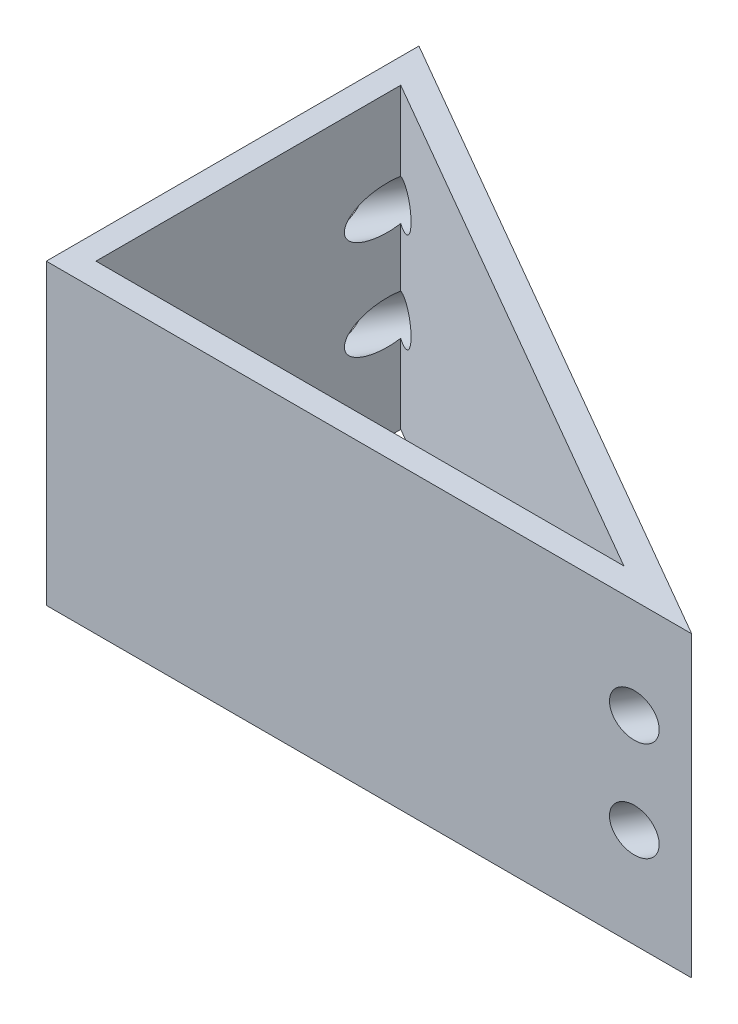
ISO-10303-21;
HEADER;
FILE_DESCRIPTION(('STEP AP214'),'2;1');
FILE_NAME('part.step','',(''),(''),'','','');
FILE_SCHEMA(('AUTOMOTIVE_DESIGN { 1 0 10303 214 1 1 1 1 }'));
ENDSEC;
DATA;
#1=APPLICATION_CONTEXT('core data for automotive mechanical design processes');
#2=APPLICATION_PROTOCOL_DEFINITION('international standard','automotive_design',2000,#1);
#3=PRODUCT_CONTEXT('',#1,'mechanical');
#4=PRODUCT('Part','Part','',(#3));
#5=PRODUCT_RELATED_PRODUCT_CATEGORY('part','',(#4));
#6=PRODUCT_DEFINITION_FORMATION('','',#4);
#7=PRODUCT_DEFINITION_CONTEXT('part definition',#1,'design');
#8=PRODUCT_DEFINITION('design','',#6,#7);
#9=PRODUCT_DEFINITION_SHAPE('','',#8);
#10=(LENGTH_UNIT() NAMED_UNIT(*) SI_UNIT(.MILLI.,.METRE.));
#11=(NAMED_UNIT(*) PLANE_ANGLE_UNIT() SI_UNIT($,.RADIAN.));
#12=(NAMED_UNIT(*) SI_UNIT($,.STERADIAN.) SOLID_ANGLE_UNIT());
#13=UNCERTAINTY_MEASURE_WITH_UNIT(LENGTH_MEASURE(1.E-05),#10,'distance_accuracy_value','');
#14=(GEOMETRIC_REPRESENTATION_CONTEXT(3) GLOBAL_UNCERTAINTY_ASSIGNED_CONTEXT((#13)) GLOBAL_UNIT_ASSIGNED_CONTEXT((#10,
#11,#12)) REPRESENTATION_CONTEXT('',''));
#15=CARTESIAN_POINT('',(0.,0.,0.));
#16=DIRECTION('',(0.,0.,1.));
#17=DIRECTION('',(1.,0.,0.));
#18=AXIS2_PLACEMENT_3D('',#15,#16,#17);
#19=CARTESIAN_POINT('',(82.4889197104681,38.1,0.));
#20=DIRECTION('',(0.,0.,-1.));
#21=DIRECTION('',(-1.,0.,0.));
#22=AXIS2_PLACEMENT_3D('',#19,#20,#21);
#23=PLANE('',#22);
#24=CARTESIAN_POINT('',(75.1565712917599,12.7,0.));
#25=DIRECTION('',(0.,0.,-1.));
#26=DIRECTION('',(1.,0.,0.));
#27=AXIS2_PLACEMENT_3D('',#24,#25,#26);
#28=ELLIPSE('',#27,3.17542648054292,2.74999999999999);
#29=CARTESIAN_POINT('',(78.3319977723028,12.7,0.));
#30=VERTEX_POINT('',#29);
#31=EDGE_CURVE('E214',#30,#30,#28,.T.);
#32=ORIENTED_EDGE('',*,*,#31,.T.);
#33=EDGE_LOOP('',(#32));
#34=FACE_BOUND('',#33,.T.);
#35=CARTESIAN_POINT('',(75.1565712917599,25.4,0.));
#36=DIRECTION('',(0.,0.,-1.));
#37=DIRECTION('',(1.,0.,0.));
#38=AXIS2_PLACEMENT_3D('',#35,#36,#37);
#39=ELLIPSE('',#38,3.17542648054292,2.74999999999999);
#40=CARTESIAN_POINT('',(78.3319977723028,25.4,0.));
#41=VERTEX_POINT('',#40);
#42=EDGE_CURVE('E159',#41,#41,#39,.T.);
#43=ORIENTED_EDGE('',*,*,#42,.T.);
#44=EDGE_LOOP('',(#43));
#45=FACE_BOUND('',#44,.T.);
#46=DIRECTION('',(1.,0.,0.));
#47=VECTOR('',#46,1.);
#48=CARTESIAN_POINT('',(82.4889197104681,0.,0.));
#49=LINE('',#48,#47);
#50=CARTESIAN_POINT('',(0.,0.,0.));
#51=VERTEX_POINT('',#50);
#52=CARTESIAN_POINT('',(82.4889197104681,0.,0.));
#53=VERTEX_POINT('',#52);
#54=EDGE_CURVE('E112',#51,#53,#49,.T.);
#55=ORIENTED_EDGE('',*,*,#54,.T.);
#56=DIRECTION('',(0.,-1.,0.));
#57=VECTOR('',#56,1.);
#58=CARTESIAN_POINT('',(82.4889197104681,38.1,0.));
#59=LINE('',#58,#57);
#60=CARTESIAN_POINT('',(82.4889197104681,38.1,0.));
#61=VERTEX_POINT('',#60);
#62=EDGE_CURVE('E146',#61,#53,#59,.T.);
#63=ORIENTED_EDGE('',*,*,#62,.F.);
#64=DIRECTION('',(1.,0.,0.));
#65=VECTOR('',#64,1.);
#66=CARTESIAN_POINT('',(82.4889197104681,38.1,0.));
#67=LINE('',#66,#65);
#68=CARTESIAN_POINT('',(0.,38.1,0.));
#69=VERTEX_POINT('',#68);
#70=EDGE_CURVE('E130',#69,#61,#67,.T.);
#71=ORIENTED_EDGE('',*,*,#70,.F.);
#72=DIRECTION('',(0.,-1.,0.));
#73=VECTOR('',#72,1.);
#74=CARTESIAN_POINT('',(0.,38.1,0.));
#75=LINE('',#74,#73);
#76=EDGE_CURVE('E137',#69,#51,#75,.T.);
#77=ORIENTED_EDGE('',*,*,#76,.T.);
#78=EDGE_LOOP('',(#55,#63,#71,#77));
#79=FACE_BOUND('',#78,.T.);
#80=ADVANCED_FACE('F36',(#34,#45,#79),#23,.F.);
#81=CARTESIAN_POINT('',(0.,38.1,-47.6249999999995));
#82=DIRECTION('',(-0.499999999999995,0.,0.866025403784442));
#83=DIRECTION('',(0.866025403784442,0.,0.499999999999995));
#84=AXIS2_PLACEMENT_3D('',#81,#82,#83);
#85=PLANE('',#84);
#86=CARTESIAN_POINT('',(5.49926131403122,12.7,-44.4499999999995));
#87=DIRECTION('',(0.499999999999995,0.,-0.866025403784442));
#88=DIRECTION('',(-0.866025403784442,0.,-0.499999999999995));
#89=AXIS2_PLACEMENT_3D('',#86,#87,#88);
#90=CIRCLE('',#89,2.74999999999999);
#91=CARTESIAN_POINT('',(3.11769145362401,12.7,-45.8249999999995));
#92=VERTEX_POINT('',#91);
#93=EDGE_CURVE('E106',#92,#92,#90,.T.);
#94=ORIENTED_EDGE('',*,*,#93,.F.);
#95=EDGE_LOOP('',(#94));
#96=FACE_BOUND('',#95,.T.);
#97=CARTESIAN_POINT('',(76.9896583964369,12.7,-3.17499999999996));
#98=DIRECTION('',(0.499999999999995,0.,-0.866025403784442));
#99=DIRECTION('',(-0.866025403784442,0.,-0.499999999999995));
#100=AXIS2_PLACEMENT_3D('',#97,#98,#99);
#101=CIRCLE('',#100,2.74999999999999);
#102=CARTESIAN_POINT('',(74.6080885360297,12.7,-4.54999999999994));
#103=VERTEX_POINT('',#102);
#104=EDGE_CURVE('E223',#103,#103,#101,.T.);
#105=ORIENTED_EDGE('',*,*,#104,.F.);
#106=EDGE_LOOP('',(#105));
#107=FACE_BOUND('',#106,.T.);
#108=CARTESIAN_POINT('',(76.9896583964369,25.4,-3.17499999999996));
#109=DIRECTION('',(0.499999999999995,0.,-0.866025403784442));
#110=DIRECTION('',(-0.866025403784442,0.,-0.499999999999995));
#111=AXIS2_PLACEMENT_3D('',#108,#109,#110);
#112=CIRCLE('',#111,2.74999999999999);
#113=CARTESIAN_POINT('',(74.6080885360297,25.4,-4.54999999999994));
#114=VERTEX_POINT('',#113);
#115=EDGE_CURVE('E218',#114,#114,#112,.T.);
#116=ORIENTED_EDGE('',*,*,#115,.F.);
#117=EDGE_LOOP('',(#116));
#118=FACE_BOUND('',#117,.T.);
#119=CARTESIAN_POINT('',(5.49926131403122,25.4,-44.4499999999995));
#120=DIRECTION('',(0.499999999999995,0.,-0.866025403784442));
#121=DIRECTION('',(-0.866025403784442,0.,-0.499999999999995));
#122=AXIS2_PLACEMENT_3D('',#119,#120,#121);
#123=CIRCLE('',#122,2.74999999999999);
#124=CARTESIAN_POINT('',(3.11769145362401,25.4,-45.8249999999995));
#125=VERTEX_POINT('',#124);
#126=EDGE_CURVE('E153',#125,#125,#123,.T.);
#127=ORIENTED_EDGE('',*,*,#126,.F.);
#128=EDGE_LOOP('',(#127));
#129=FACE_BOUND('',#128,.T.);
#130=DIRECTION('',(-0.866025403784442,0.,-0.499999999999995));
#131=VECTOR('',#130,1.);
#132=CARTESIAN_POINT('',(0.,0.,-47.6249999999995));
#133=LINE('',#132,#131);
#134=CARTESIAN_POINT('',(0.,0.,-47.6249999999995));
#135=VERTEX_POINT('',#134);
#136=EDGE_CURVE('E116',#53,#135,#133,.T.);
#137=ORIENTED_EDGE('',*,*,#136,.T.);
#138=DIRECTION('',(0.,-1.,0.));
#139=VECTOR('',#138,1.);
#140=CARTESIAN_POINT('',(0.,38.1,-47.6249999999995));
#141=LINE('',#140,#139);
#142=CARTESIAN_POINT('',(0.,38.1,-47.6249999999995));
#143=VERTEX_POINT('',#142);
#144=EDGE_CURVE('E143',#143,#135,#141,.T.);
#145=ORIENTED_EDGE('',*,*,#144,.F.);
#146=DIRECTION('',(-0.866025403784442,0.,-0.499999999999995));
#147=VECTOR('',#146,1.);
#148=CARTESIAN_POINT('',(0.,38.1,-47.6249999999995));
#149=LINE('',#148,#147);
#150=EDGE_CURVE('E133',#61,#143,#149,.T.);
#151=ORIENTED_EDGE('',*,*,#150,.F.);
#152=ORIENTED_EDGE('',*,*,#62,.T.);
#153=EDGE_LOOP('',(#137,#145,#151,#152));
#154=FACE_BOUND('',#153,.T.);
#155=ADVANCED_FACE('F196',(#96,#107,#118,#129,#154),#85,.F.);
#156=CARTESIAN_POINT('',(0.,38.1,0.));
#157=DIRECTION('',(1.,0.,0.));
#158=DIRECTION('',(0.,0.,-1.));
#159=AXIS2_PLACEMENT_3D('',#156,#157,#158);
#160=PLANE('',#159);
#161=CARTESIAN_POINT('',(0.,12.7,-34.9249999999993));
#162=DIRECTION('',(1.,0.,0.));
#163=DIRECTION('',(0.,0.,-1.));
#164=AXIS2_PLACEMENT_3D('',#161,#162,#163);
#165=ELLIPSE('',#164,5.50000000000004,2.74999999999999);
#166=CARTESIAN_POINT('',(0.,12.7,-40.4249999999994));
#167=VERTEX_POINT('',#166);
#168=EDGE_CURVE('E105',#167,#167,#165,.T.);
#169=ORIENTED_EDGE('',*,*,#168,.T.);
#170=EDGE_LOOP('',(#169));
#171=FACE_BOUND('',#170,.T.);
#172=CARTESIAN_POINT('',(0.,25.4,-34.9249999999993));
#173=DIRECTION('',(1.,0.,0.));
#174=DIRECTION('',(0.,0.,-1.));
#175=AXIS2_PLACEMENT_3D('',#172,#173,#174);
#176=ELLIPSE('',#175,5.50000000000004,2.74999999999999);
#177=CARTESIAN_POINT('',(0.,25.4,-40.4249999999994));
#178=VERTEX_POINT('',#177);
#179=EDGE_CURVE('E152',#178,#178,#176,.T.);
#180=ORIENTED_EDGE('',*,*,#179,.T.);
#181=EDGE_LOOP('',(#180));
#182=FACE_BOUND('',#181,.T.);
#183=DIRECTION('',(0.,0.,1.));
#184=VECTOR('',#183,1.);
#185=CARTESIAN_POINT('',(0.,0.,0.));
#186=LINE('',#185,#184);
#187=EDGE_CURVE('E134',#135,#51,#186,.T.);
#188=ORIENTED_EDGE('',*,*,#187,.T.);
#189=ORIENTED_EDGE('',*,*,#76,.F.);
#190=DIRECTION('',(0.,0.,1.));
#191=VECTOR('',#190,1.);
#192=CARTESIAN_POINT('',(0.,38.1,0.));
#193=LINE('',#192,#191);
#194=EDGE_CURVE('E136',#143,#69,#193,.T.);
#195=ORIENTED_EDGE('',*,*,#194,.F.);
#196=ORIENTED_EDGE('',*,*,#144,.T.);
#197=EDGE_LOOP('',(#188,#189,#195,#196));
#198=FACE_BOUND('',#197,.T.);
#199=ADVANCED_FACE('F193',(#171,#182,#198),#160,.F.);
#200=CARTESIAN_POINT('',(0.,38.1,0.));
#201=DIRECTION('',(0.,-1.,0.));
#202=DIRECTION('',(0.,0.,-1.));
#203=AXIS2_PLACEMENT_3D('',#200,#201,#202);
#204=PLANE('',#203);
#205=DIRECTION('',(1.,0.,0.));
#206=VECTOR('',#205,1.);
#207=CARTESIAN_POINT('',(3.175,38.1,-3.175));
#208=LINE('',#207,#206);
#209=CARTESIAN_POINT('',(3.175,38.1,-3.175));
#210=VERTEX_POINT('',#209);
#211=CARTESIAN_POINT('',(70.6396583964367,38.1,-3.175));
#212=VERTEX_POINT('',#211);
#213=EDGE_CURVE('E170',#210,#212,#208,.T.);
#214=ORIENTED_EDGE('',*,*,#213,.F.);
#215=DIRECTION('',(0.,0.,1.));
#216=VECTOR('',#215,1.);
#217=CARTESIAN_POINT('',(3.175,38.1,-42.1257386859683));
#218=LINE('',#217,#216);
#219=CARTESIAN_POINT('',(3.175,38.1,-42.1257386859683));
#220=VERTEX_POINT('',#219);
#221=EDGE_CURVE('E156',#220,#210,#218,.T.);
#222=ORIENTED_EDGE('',*,*,#221,.F.);
#223=DIRECTION('',(-0.866025403784442,0.,-0.499999999999995));
#224=VECTOR('',#223,1.);
#225=CARTESIAN_POINT('',(70.6396583964367,38.1,-3.175));
#226=LINE('',#225,#224);
#227=EDGE_CURVE('E165',#212,#220,#226,.T.);
#228=ORIENTED_EDGE('',*,*,#227,.F.);
#229=EDGE_LOOP('',(#214,#222,#228));
#230=FACE_BOUND('',#229,.T.);
#231=ORIENTED_EDGE('',*,*,#70,.T.);
#232=ORIENTED_EDGE('',*,*,#150,.T.);
#233=ORIENTED_EDGE('',*,*,#194,.T.);
#234=EDGE_LOOP('',(#231,#232,#233));
#235=FACE_BOUND('',#234,.T.);
#236=ADVANCED_FACE('F175',(#230,#235),#204,.F.);
#237=CARTESIAN_POINT('',(0.,0.,0.));
#238=DIRECTION('',(0.,-1.,0.));
#239=DIRECTION('',(0.,0.,-1.));
#240=AXIS2_PLACEMENT_3D('',#237,#238,#239);
#241=PLANE('',#240);
#242=DIRECTION('',(0.,0.,1.));
#243=VECTOR('',#242,1.);
#244=CARTESIAN_POINT('',(3.175,0.,-42.1257386859683));
#245=LINE('',#244,#243);
#246=CARTESIAN_POINT('',(3.175,0.,-42.1257386859683));
#247=VERTEX_POINT('',#246);
#248=CARTESIAN_POINT('',(3.175,0.,-3.175));
#249=VERTEX_POINT('',#248);
#250=EDGE_CURVE('E110',#247,#249,#245,.T.);
#251=ORIENTED_EDGE('',*,*,#250,.T.);
#252=DIRECTION('',(1.,0.,0.));
#253=VECTOR('',#252,1.);
#254=CARTESIAN_POINT('',(3.175,0.,-3.175));
#255=LINE('',#254,#253);
#256=CARTESIAN_POINT('',(70.6396583964367,0.,-3.175));
#257=VERTEX_POINT('',#256);
#258=EDGE_CURVE('E164',#249,#257,#255,.T.);
#259=ORIENTED_EDGE('',*,*,#258,.T.);
#260=DIRECTION('',(-0.866025403784442,0.,-0.499999999999995));
#261=VECTOR('',#260,1.);
#262=CARTESIAN_POINT('',(70.6396583964367,0.,-3.175));
#263=LINE('',#262,#261);
#264=EDGE_CURVE('E127',#257,#247,#263,.T.);
#265=ORIENTED_EDGE('',*,*,#264,.T.);
#266=EDGE_LOOP('',(#251,#259,#265));
#267=FACE_BOUND('',#266,.T.);
#268=ORIENTED_EDGE('',*,*,#54,.F.);
#269=ORIENTED_EDGE('',*,*,#187,.F.);
#270=ORIENTED_EDGE('',*,*,#136,.F.);
#271=EDGE_LOOP('',(#268,#269,#270));
#272=FACE_BOUND('',#271,.T.);
#273=ADVANCED_FACE('F181',(#267,#272),#241,.T.);
#274=CARTESIAN_POINT('',(3.175,0.,-42.1257386859683));
#275=DIRECTION('',(-1.,0.,0.));
#276=DIRECTION('',(0.,0.,1.));
#277=AXIS2_PLACEMENT_3D('',#274,#275,#276);
#278=PLANE('',#277);
#279=DIRECTION('',(0.,1.,0.));
#280=VECTOR('',#279,1.);
#281=CARTESIAN_POINT('',(3.175,0.,-42.1257386859683));
#282=LINE('',#281,#280);
#283=CARTESIAN_POINT('',(3.175,10.0849008263173,-42.1257386859683));
#284=VERTEX_POINT('',#283);
#285=EDGE_CURVE('E102',#247,#284,#282,.T.);
#286=ORIENTED_EDGE('',*,*,#285,.T.);
#287=CARTESIAN_POINT('',(3.175,12.7,-40.4242613140306));
#288=DIRECTION('',(-1.,0.,0.));
#289=DIRECTION('',(0.,0.,-1.));
#290=AXIS2_PLACEMENT_3D('',#287,#288,#289);
#291=ELLIPSE('',#290,5.50000000000004,2.74999999999999);
#292=CARTESIAN_POINT('',(3.175,15.3150991736827,-42.1257386859683));
#293=VERTEX_POINT('',#292);
#294=EDGE_CURVE('E11',#284,#293,#291,.T.);
#295=ORIENTED_EDGE('',*,*,#294,.T.);
#296=CARTESIAN_POINT('',(3.175,22.7849008263173,-42.1257386859683));
#297=VERTEX_POINT('',#296);
#298=EDGE_CURVE('E55',#293,#297,#282,.T.);
#299=ORIENTED_EDGE('',*,*,#298,.T.);
#300=CARTESIAN_POINT('',(3.175,25.4,-40.4242613140306));
#301=DIRECTION('',(-1.,0.,0.));
#302=DIRECTION('',(0.,0.,-1.));
#303=AXIS2_PLACEMENT_3D('',#300,#301,#302);
#304=ELLIPSE('',#303,5.50000000000004,2.74999999999999);
#305=CARTESIAN_POINT('',(3.175,28.0150991736827,-42.1257386859683));
#306=VERTEX_POINT('',#305);
#307=EDGE_CURVE('E151',#297,#306,#304,.T.);
#308=ORIENTED_EDGE('',*,*,#307,.T.);
#309=EDGE_CURVE('E114',#306,#220,#282,.T.);
#310=ORIENTED_EDGE('',*,*,#309,.T.);
#311=ORIENTED_EDGE('',*,*,#221,.T.);
#312=DIRECTION('',(0.,1.,0.));
#313=VECTOR('',#312,1.);
#314=CARTESIAN_POINT('',(3.175,0.,-3.175));
#315=LINE('',#314,#313);
#316=EDGE_CURVE('E123',#249,#210,#315,.T.);
#317=ORIENTED_EDGE('',*,*,#316,.F.);
#318=ORIENTED_EDGE('',*,*,#250,.F.);
#319=EDGE_LOOP('',(#286,#295,#299,#308,#310,#311,#317,#318));
#320=FACE_BOUND('',#319,.T.);
#321=ADVANCED_FACE('F108',(#320),#278,.F.);
#322=CARTESIAN_POINT('',(70.6396583964367,0.,-3.175));
#323=DIRECTION('',(0.499999999999994,0.,-0.866025403784442));
#324=DIRECTION('',(-0.866025403784442,0.,-0.499999999999995));
#325=AXIS2_PLACEMENT_3D('',#322,#323,#324);
#326=PLANE('',#325);
#327=ORIENTED_EDGE('',*,*,#298,.F.);
#328=CARTESIAN_POINT('',(3.91176131403122,12.7,-41.7003693429839));
#329=DIRECTION('',(0.499999999999994,0.,-0.866025403784442));
#330=DIRECTION('',(-0.866025403784442,0.,-0.499999999999995));
#331=AXIS2_PLACEMENT_3D('',#328,#329,#330);
#332=CIRCLE('',#331,2.74999999999999);
#333=EDGE_CURVE('E49',#293,#284,#332,.T.);
#334=ORIENTED_EDGE('',*,*,#333,.T.);
#335=ORIENTED_EDGE('',*,*,#285,.F.);
#336=ORIENTED_EDGE('',*,*,#264,.F.);
#337=DIRECTION('',(0.,1.,0.));
#338=VECTOR('',#337,1.);
#339=CARTESIAN_POINT('',(70.6396583964367,0.,-3.175));
#340=LINE('',#339,#338);
#341=EDGE_CURVE('E120',#257,#212,#340,.T.);
#342=ORIENTED_EDGE('',*,*,#341,.T.);
#343=ORIENTED_EDGE('',*,*,#227,.T.);
#344=ORIENTED_EDGE('',*,*,#309,.F.);
#345=CARTESIAN_POINT('',(3.91176131403122,25.4,-41.7003693429839));
#346=DIRECTION('',(0.499999999999994,0.,-0.866025403784442));
#347=DIRECTION('',(-0.866025403784442,0.,-0.499999999999995));
#348=AXIS2_PLACEMENT_3D('',#345,#346,#347);
#349=CIRCLE('',#348,2.74999999999999);
#350=EDGE_CURVE('E43',#306,#297,#349,.T.);
#351=ORIENTED_EDGE('',*,*,#350,.T.);
#352=EDGE_LOOP('',(#327,#334,#335,#336,#342,#343,#344,#351));
#353=FACE_BOUND('',#352,.T.);
#354=ADVANCED_FACE('F101',(#353),#326,.F.);
#355=CARTESIAN_POINT('',(3.175,0.,-3.175));
#356=DIRECTION('',(0.,0.,1.));
#357=DIRECTION('',(1.,0.,0.));
#358=AXIS2_PLACEMENT_3D('',#355,#356,#357);
#359=PLANE('',#358);
#360=ORIENTED_EDGE('',*,*,#213,.T.);
#361=ORIENTED_EDGE('',*,*,#341,.F.);
#362=ORIENTED_EDGE('',*,*,#258,.F.);
#363=ORIENTED_EDGE('',*,*,#316,.T.);
#364=EDGE_LOOP('',(#360,#361,#362,#363));
#365=FACE_BOUND('',#364,.T.);
#366=ADVANCED_FACE('F179',(#365),#359,.F.);
#367=CARTESIAN_POINT('',(5.49926131403122,25.4,-44.4499999999995));
#368=DIRECTION('',(0.499999999999995,0.,-0.866025403784442));
#369=DIRECTION('',(-0.866025403784442,0.,-0.499999999999995));
#370=AXIS2_PLACEMENT_3D('',#367,#368,#369);
#371=CYLINDRICAL_SURFACE('',#370,2.74999999999999);
#372=ORIENTED_EDGE('',*,*,#350,.F.);
#373=ORIENTED_EDGE('',*,*,#307,.F.);
#374=EDGE_LOOP('',(#372,#373));
#375=FACE_BOUND('',#374,.T.);
#376=ORIENTED_EDGE('',*,*,#126,.T.);
#377=EDGE_LOOP('',(#376));
#378=FACE_BOUND('',#377,.T.);
#379=ORIENTED_EDGE('',*,*,#179,.F.);
#380=EDGE_LOOP('',(#379));
#381=FACE_BOUND('',#380,.T.);
#382=ADVANCED_FACE('F149',(#375,#378,#381),#371,.F.);
#383=CARTESIAN_POINT('',(76.9896583964369,25.4,-3.17499999999996));
#384=DIRECTION('',(0.499999999999995,0.,-0.866025403784442));
#385=DIRECTION('',(-0.866025403784442,0.,-0.499999999999995));
#386=AXIS2_PLACEMENT_3D('',#383,#384,#385);
#387=CYLINDRICAL_SURFACE('',#386,2.74999999999999);
#388=ORIENTED_EDGE('',*,*,#115,.T.);
#389=EDGE_LOOP('',(#388));
#390=FACE_BOUND('',#389,.T.);
#391=ORIENTED_EDGE('',*,*,#42,.F.);
#392=EDGE_LOOP('',(#391));
#393=FACE_BOUND('',#392,.T.);
#394=ADVANCED_FACE('F239',(#390,#393),#387,.F.);
#395=CARTESIAN_POINT('',(76.9896583964369,12.7,-3.17499999999996));
#396=DIRECTION('',(0.499999999999995,0.,-0.866025403784442));
#397=DIRECTION('',(-0.866025403784442,0.,-0.499999999999995));
#398=AXIS2_PLACEMENT_3D('',#395,#396,#397);
#399=CYLINDRICAL_SURFACE('',#398,2.74999999999999);
#400=ORIENTED_EDGE('',*,*,#104,.T.);
#401=EDGE_LOOP('',(#400));
#402=FACE_BOUND('',#401,.T.);
#403=ORIENTED_EDGE('',*,*,#31,.F.);
#404=EDGE_LOOP('',(#403));
#405=FACE_BOUND('',#404,.T.);
#406=ADVANCED_FACE('F247',(#402,#405),#399,.F.);
#407=CARTESIAN_POINT('',(5.49926131403122,12.7,-44.4499999999995));
#408=DIRECTION('',(0.499999999999995,0.,-0.866025403784442));
#409=DIRECTION('',(-0.866025403784442,0.,-0.499999999999995));
#410=AXIS2_PLACEMENT_3D('',#407,#408,#409);
#411=CYLINDRICAL_SURFACE('',#410,2.74999999999999);
#412=ORIENTED_EDGE('',*,*,#294,.F.);
#413=ORIENTED_EDGE('',*,*,#333,.F.);
#414=EDGE_LOOP('',(#412,#413));
#415=FACE_BOUND('',#414,.T.);
#416=ORIENTED_EDGE('',*,*,#93,.T.);
#417=EDGE_LOOP('',(#416));
#418=FACE_BOUND('',#417,.T.);
#419=ORIENTED_EDGE('',*,*,#168,.F.);
#420=EDGE_LOOP('',(#419));
#421=FACE_BOUND('',#420,.T.);
#422=ADVANCED_FACE('F97',(#415,#418,#421),#411,.F.);
#423=CLOSED_SHELL('',(#80,#155,#199,#236,#273,#321,#354,#366,#382,#394,#406,#422));
#424=MANIFOLD_SOLID_BREP('B2',#423);
#425=ADVANCED_BREP_SHAPE_REPRESENTATION('',(#18,#424),#14);
#426=SHAPE_DEFINITION_REPRESENTATION(#9,#425);
ENDSEC;
END-ISO-10303-21;
